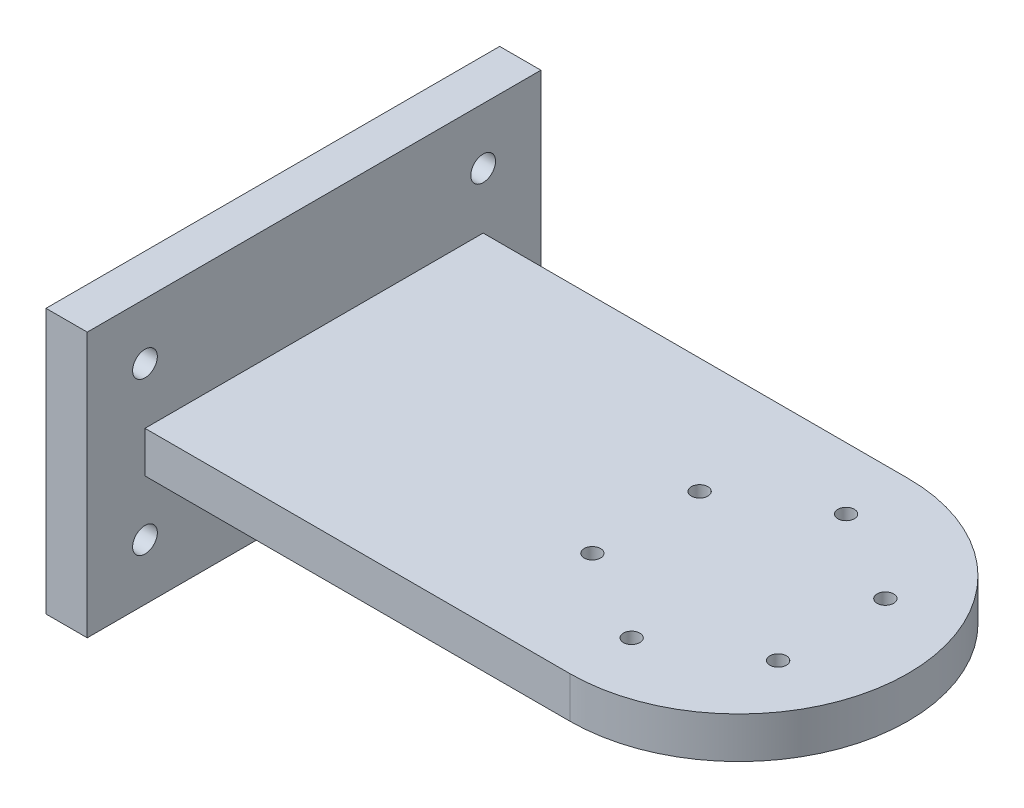
ISO-10303-21;
HEADER;
FILE_DESCRIPTION(('STEP AP214'),'2;1');
FILE_NAME('part.step','',(''),(''),'','','');
FILE_SCHEMA(('AUTOMOTIVE_DESIGN { 1 0 10303 214 1 1 1 1 }'));
ENDSEC;
DATA;
#1=APPLICATION_CONTEXT('core data for automotive mechanical design processes');
#2=APPLICATION_PROTOCOL_DEFINITION('international standard','automotive_design',2000,#1);
#3=PRODUCT_CONTEXT('',#1,'mechanical');
#4=PRODUCT('Part','Part','',(#3));
#5=PRODUCT_RELATED_PRODUCT_CATEGORY('part','',(#4));
#6=PRODUCT_DEFINITION_FORMATION('','',#4);
#7=PRODUCT_DEFINITION_CONTEXT('part definition',#1,'design');
#8=PRODUCT_DEFINITION('design','',#6,#7);
#9=PRODUCT_DEFINITION_SHAPE('','',#8);
#10=(LENGTH_UNIT() NAMED_UNIT(*) SI_UNIT(.MILLI.,.METRE.));
#11=(NAMED_UNIT(*) PLANE_ANGLE_UNIT() SI_UNIT($,.RADIAN.));
#12=(NAMED_UNIT(*) SI_UNIT($,.STERADIAN.) SOLID_ANGLE_UNIT());
#13=UNCERTAINTY_MEASURE_WITH_UNIT(LENGTH_MEASURE(1.E-05),#10,'distance_accuracy_value','');
#14=(GEOMETRIC_REPRESENTATION_CONTEXT(3) GLOBAL_UNCERTAINTY_ASSIGNED_CONTEXT((#13)) GLOBAL_UNIT_ASSIGNED_CONTEXT((#10,
#11,#12)) REPRESENTATION_CONTEXT('',''));
#15=CARTESIAN_POINT('',(0.,0.,0.));
#16=DIRECTION('',(0.,0.,1.));
#17=DIRECTION('',(1.,0.,0.));
#18=AXIS2_PLACEMENT_3D('',#15,#16,#17);
#19=CARTESIAN_POINT('',(0.,-10.,0.));
#20=DIRECTION('',(0.,1.,0.));
#21=DIRECTION('',(1.,0.,0.));
#22=AXIS2_PLACEMENT_3D('',#19,#20,#21);
#23=PLANE('',#22);
#24=CARTESIAN_POINT('',(-22.5166604983954,-10.,13.));
#25=DIRECTION('',(0.,1.,0.));
#26=DIRECTION('',(-1.,0.,0.));
#27=AXIS2_PLACEMENT_3D('',#24,#25,#26);
#28=CIRCLE('',#27,2.);
#29=CARTESIAN_POINT('',(-20.5166604983954,-10.,13.));
#30=VERTEX_POINT('',#29);
#31=EDGE_CURVE('E39',#30,#30,#28,.T.);
#32=ORIENTED_EDGE('',*,*,#31,.T.);
#33=EDGE_LOOP('',(#32));
#34=FACE_BOUND('',#33,.T.);
#35=CARTESIAN_POINT('',(22.5166604983954,-10.,13.));
#36=DIRECTION('',(0.,1.,0.));
#37=DIRECTION('',(-1.,0.,0.));
#38=AXIS2_PLACEMENT_3D('',#35,#36,#37);
#39=CIRCLE('',#38,2.);
#40=CARTESIAN_POINT('',(24.5166604983954,-10.,13.));
#41=VERTEX_POINT('',#40);
#42=EDGE_CURVE('E142',#41,#41,#39,.T.);
#43=ORIENTED_EDGE('',*,*,#42,.T.);
#44=EDGE_LOOP('',(#43));
#45=FACE_BOUND('',#44,.T.);
#46=CARTESIAN_POINT('',(22.5166604983954,-10.,-13.));
#47=DIRECTION('',(0.,1.,0.));
#48=DIRECTION('',(-1.,0.,0.));
#49=AXIS2_PLACEMENT_3D('',#46,#47,#48);
#50=CIRCLE('',#49,2.);
#51=CARTESIAN_POINT('',(24.5166604983954,-10.,-13.));
#52=VERTEX_POINT('',#51);
#53=EDGE_CURVE('E312',#52,#52,#50,.T.);
#54=ORIENTED_EDGE('',*,*,#53,.T.);
#55=EDGE_LOOP('',(#54));
#56=FACE_BOUND('',#55,.T.);
#57=CARTESIAN_POINT('',(-22.5166604983954,-10.,-13.));
#58=DIRECTION('',(0.,1.,0.));
#59=DIRECTION('',(-1.,0.,0.));
#60=AXIS2_PLACEMENT_3D('',#57,#58,#59);
#61=CIRCLE('',#60,2.);
#62=CARTESIAN_POINT('',(-20.5166604983954,-10.,-13.));
#63=VERTEX_POINT('',#62);
#64=EDGE_CURVE('E293',#63,#63,#61,.T.);
#65=ORIENTED_EDGE('',*,*,#64,.T.);
#66=EDGE_LOOP('',(#65));
#67=FACE_BOUND('',#66,.T.);
#68=CARTESIAN_POINT('',(0.,-10.,26.));
#69=DIRECTION('',(0.,1.,0.));
#70=DIRECTION('',(-1.,0.,0.));
#71=AXIS2_PLACEMENT_3D('',#68,#69,#70);
#72=CIRCLE('',#71,2.);
#73=CARTESIAN_POINT('',(2.,-10.,26.));
#74=VERTEX_POINT('',#73);
#75=EDGE_CURVE('E238',#74,#74,#72,.T.);
#76=ORIENTED_EDGE('',*,*,#75,.T.);
#77=EDGE_LOOP('',(#76));
#78=FACE_BOUND('',#77,.T.);
#79=CARTESIAN_POINT('',(0.,-10.,-26.));
#80=DIRECTION('',(0.,1.,0.));
#81=DIRECTION('',(-1.,0.,0.));
#82=AXIS2_PLACEMENT_3D('',#79,#80,#81);
#83=CIRCLE('',#82,2.);
#84=CARTESIAN_POINT('',(2.,-10.,-26.));
#85=VERTEX_POINT('',#84);
#86=EDGE_CURVE('E255',#85,#85,#83,.T.);
#87=ORIENTED_EDGE('',*,*,#86,.T.);
#88=EDGE_LOOP('',(#87));
#89=FACE_BOUND('',#88,.T.);
#90=CARTESIAN_POINT('',(0.,-10.,0.));
#91=DIRECTION('',(0.,-1.,0.));
#92=DIRECTION('',(-1.,0.,0.));
#93=AXIS2_PLACEMENT_3D('',#90,#91,#92);
#94=CIRCLE('',#93,41.);
#95=CARTESIAN_POINT('',(0.,-10.,-41.));
#96=VERTEX_POINT('',#95);
#97=CARTESIAN_POINT('',(0.,-10.,41.));
#98=VERTEX_POINT('',#97);
#99=EDGE_CURVE('E11',#96,#98,#94,.T.);
#100=ORIENTED_EDGE('',*,*,#99,.T.);
#101=DIRECTION('',(-1.,0.,0.));
#102=VECTOR('',#101,1.);
#103=CARTESIAN_POINT('',(-103.,-10.,41.));
#104=LINE('',#103,#102);
#105=CARTESIAN_POINT('',(-103.,-10.,41.));
#106=VERTEX_POINT('',#105);
#107=EDGE_CURVE('E265',#98,#106,#104,.T.);
#108=ORIENTED_EDGE('',*,*,#107,.T.);
#109=DIRECTION('',(0.,0.,-1.));
#110=VECTOR('',#109,1.);
#111=CARTESIAN_POINT('',(-103.,-10.,-41.));
#112=LINE('',#111,#110);
#113=CARTESIAN_POINT('',(-103.,-10.,-41.));
#114=VERTEX_POINT('',#113);
#115=EDGE_CURVE('E204',#106,#114,#112,.T.);
#116=ORIENTED_EDGE('',*,*,#115,.T.);
#117=DIRECTION('',(1.,0.,0.));
#118=VECTOR('',#117,1.);
#119=CARTESIAN_POINT('',(0.,-10.,-41.));
#120=LINE('',#119,#118);
#121=EDGE_CURVE('E199',#114,#96,#120,.T.);
#122=ORIENTED_EDGE('',*,*,#121,.T.);
#123=EDGE_LOOP('',(#100,#108,#116,#122));
#124=FACE_BOUND('',#123,.T.);
#125=ADVANCED_FACE('F17',(#34,#45,#56,#67,#78,#89,#124),#23,.F.);
#126=CARTESIAN_POINT('',(0.,0.,0.));
#127=DIRECTION('',(0.,1.,0.));
#128=DIRECTION('',(1.,0.,0.));
#129=AXIS2_PLACEMENT_3D('',#126,#127,#128);
#130=PLANE('',#129);
#131=CARTESIAN_POINT('',(-22.5166604983954,0.,13.));
#132=DIRECTION('',(0.,-1.,0.));
#133=DIRECTION('',(-1.,0.,0.));
#134=AXIS2_PLACEMENT_3D('',#131,#132,#133);
#135=CIRCLE('',#134,2.);
#136=CARTESIAN_POINT('',(-20.5166604983954,0.,13.));
#137=VERTEX_POINT('',#136);
#138=EDGE_CURVE('E343',#137,#137,#135,.T.);
#139=ORIENTED_EDGE('',*,*,#138,.T.);
#140=EDGE_LOOP('',(#139));
#141=FACE_BOUND('',#140,.T.);
#142=CARTESIAN_POINT('',(22.5166604983954,0.,13.));
#143=DIRECTION('',(0.,-1.,0.));
#144=DIRECTION('',(-1.,0.,0.));
#145=AXIS2_PLACEMENT_3D('',#142,#143,#144);
#146=CIRCLE('',#145,2.);
#147=CARTESIAN_POINT('',(24.5166604983954,0.,13.));
#148=VERTEX_POINT('',#147);
#149=EDGE_CURVE('E257',#148,#148,#146,.T.);
#150=ORIENTED_EDGE('',*,*,#149,.T.);
#151=EDGE_LOOP('',(#150));
#152=FACE_BOUND('',#151,.T.);
#153=CARTESIAN_POINT('',(22.5166604983954,0.,-13.));
#154=DIRECTION('',(0.,-1.,0.));
#155=DIRECTION('',(-1.,0.,0.));
#156=AXIS2_PLACEMENT_3D('',#153,#154,#155);
#157=CIRCLE('',#156,2.);
#158=CARTESIAN_POINT('',(24.5166604983954,0.,-13.));
#159=VERTEX_POINT('',#158);
#160=EDGE_CURVE('E313',#159,#159,#157,.T.);
#161=ORIENTED_EDGE('',*,*,#160,.T.);
#162=EDGE_LOOP('',(#161));
#163=FACE_BOUND('',#162,.T.);
#164=CARTESIAN_POINT('',(-22.5166604983954,0.,-13.));
#165=DIRECTION('',(0.,-1.,0.));
#166=DIRECTION('',(-1.,0.,0.));
#167=AXIS2_PLACEMENT_3D('',#164,#165,#166);
#168=CIRCLE('',#167,2.);
#169=CARTESIAN_POINT('',(-20.5166604983954,0.,-13.));
#170=VERTEX_POINT('',#169);
#171=EDGE_CURVE('E233',#170,#170,#168,.T.);
#172=ORIENTED_EDGE('',*,*,#171,.T.);
#173=EDGE_LOOP('',(#172));
#174=FACE_BOUND('',#173,.T.);
#175=CARTESIAN_POINT('',(0.,0.,26.));
#176=DIRECTION('',(0.,-1.,0.));
#177=DIRECTION('',(-1.,0.,0.));
#178=AXIS2_PLACEMENT_3D('',#175,#176,#177);
#179=CIRCLE('',#178,2.);
#180=CARTESIAN_POINT('',(2.,0.,26.));
#181=VERTEX_POINT('',#180);
#182=EDGE_CURVE('E270',#181,#181,#179,.T.);
#183=ORIENTED_EDGE('',*,*,#182,.T.);
#184=EDGE_LOOP('',(#183));
#185=FACE_BOUND('',#184,.T.);
#186=CARTESIAN_POINT('',(0.,0.,-26.));
#187=DIRECTION('',(0.,-1.,0.));
#188=DIRECTION('',(-1.,0.,0.));
#189=AXIS2_PLACEMENT_3D('',#186,#187,#188);
#190=CIRCLE('',#189,2.);
#191=CARTESIAN_POINT('',(2.,0.,-26.));
#192=VERTEX_POINT('',#191);
#193=EDGE_CURVE('E239',#192,#192,#190,.T.);
#194=ORIENTED_EDGE('',*,*,#193,.T.);
#195=EDGE_LOOP('',(#194));
#196=FACE_BOUND('',#195,.T.);
#197=CARTESIAN_POINT('',(0.,0.,0.));
#198=DIRECTION('',(0.,1.,0.));
#199=DIRECTION('',(-1.,0.,0.));
#200=AXIS2_PLACEMENT_3D('',#197,#198,#199);
#201=CIRCLE('',#200,41.);
#202=CARTESIAN_POINT('',(0.,0.,41.));
#203=VERTEX_POINT('',#202);
#204=CARTESIAN_POINT('',(0.,0.,-41.));
#205=VERTEX_POINT('',#204);
#206=EDGE_CURVE('E28',#203,#205,#201,.T.);
#207=ORIENTED_EDGE('',*,*,#206,.T.);
#208=DIRECTION('',(-1.,0.,0.));
#209=VECTOR('',#208,1.);
#210=CARTESIAN_POINT('',(0.,0.,-41.));
#211=LINE('',#210,#209);
#212=CARTESIAN_POINT('',(-103.,0.,-41.));
#213=VERTEX_POINT('',#212);
#214=EDGE_CURVE('E181',#205,#213,#211,.T.);
#215=ORIENTED_EDGE('',*,*,#214,.T.);
#216=DIRECTION('',(0.,0.,1.));
#217=VECTOR('',#216,1.);
#218=CARTESIAN_POINT('',(-103.,0.,-41.));
#219=LINE('',#218,#217);
#220=CARTESIAN_POINT('',(-103.,0.,41.));
#221=VERTEX_POINT('',#220);
#222=EDGE_CURVE('E186',#213,#221,#219,.T.);
#223=ORIENTED_EDGE('',*,*,#222,.T.);
#224=DIRECTION('',(1.,0.,0.));
#225=VECTOR('',#224,1.);
#226=CARTESIAN_POINT('',(-103.,0.,41.));
#227=LINE('',#226,#225);
#228=EDGE_CURVE('E262',#221,#203,#227,.T.);
#229=ORIENTED_EDGE('',*,*,#228,.T.);
#230=EDGE_LOOP('',(#207,#215,#223,#229));
#231=FACE_BOUND('',#230,.T.);
#232=ADVANCED_FACE('F183',(#141,#152,#163,#174,#185,#196,#231),#130,.T.);
#233=CARTESIAN_POINT('',(0.,0.,0.));
#234=DIRECTION('',(0.,-1.,0.));
#235=DIRECTION('',(1.,0.,0.));
#236=AXIS2_PLACEMENT_3D('',#233,#234,#235);
#237=CYLINDRICAL_SURFACE('',#236,41.);
#238=DIRECTION('',(0.,-1.,0.));
#239=VECTOR('',#238,1.);
#240=CARTESIAN_POINT('',(0.,0.,-41.));
#241=LINE('',#240,#239);
#242=EDGE_CURVE('E192',#205,#96,#241,.T.);
#243=ORIENTED_EDGE('',*,*,#242,.F.);
#244=ORIENTED_EDGE('',*,*,#206,.F.);
#245=DIRECTION('',(0.,-1.,0.));
#246=VECTOR('',#245,1.);
#247=CARTESIAN_POINT('',(0.,0.,41.));
#248=LINE('',#247,#246);
#249=EDGE_CURVE('E21',#203,#98,#248,.T.);
#250=ORIENTED_EDGE('',*,*,#249,.T.);
#251=ORIENTED_EDGE('',*,*,#99,.F.);
#252=EDGE_LOOP('',(#243,#244,#250,#251));
#253=FACE_BOUND('',#252,.T.);
#254=ADVANCED_FACE('F443',(#253),#237,.T.);
#255=CARTESIAN_POINT('',(-22.5166604983954,0.,13.));
#256=DIRECTION('',(0.,-1.,0.));
#257=DIRECTION('',(-1.,0.,0.));
#258=AXIS2_PLACEMENT_3D('',#255,#256,#257);
#259=CYLINDRICAL_SURFACE('',#258,2.);
#260=ORIENTED_EDGE('',*,*,#138,.F.);
#261=DIRECTION('',(0.,-1.,0.));
#262=VECTOR('',#261,1.);
#263=CARTESIAN_POINT('',(-20.5166604983954,0.,13.));
#264=LINE('',#263,#262);
#265=EDGE_CURVE('E335',#137,#30,#264,.T.);
#266=ORIENTED_EDGE('',*,*,#265,.T.);
#267=ORIENTED_EDGE('',*,*,#31,.F.);
#268=ORIENTED_EDGE('',*,*,#265,.F.);
#269=EDGE_LOOP('',(#260,#266,#267,#268));
#270=FACE_BOUND('',#269,.T.);
#271=ADVANCED_FACE('F454',(#270),#259,.F.);
#272=CARTESIAN_POINT('',(22.5166604983954,0.,13.));
#273=DIRECTION('',(0.,-1.,0.));
#274=DIRECTION('',(-1.,0.,0.));
#275=AXIS2_PLACEMENT_3D('',#272,#273,#274);
#276=CYLINDRICAL_SURFACE('',#275,2.);
#277=ORIENTED_EDGE('',*,*,#149,.F.);
#278=DIRECTION('',(0.,-1.,0.));
#279=VECTOR('',#278,1.);
#280=CARTESIAN_POINT('',(24.5166604983954,0.,13.));
#281=LINE('',#280,#279);
#282=EDGE_CURVE('E152',#148,#41,#281,.T.);
#283=ORIENTED_EDGE('',*,*,#282,.T.);
#284=ORIENTED_EDGE('',*,*,#42,.F.);
#285=ORIENTED_EDGE('',*,*,#282,.F.);
#286=EDGE_LOOP('',(#277,#283,#284,#285));
#287=FACE_BOUND('',#286,.T.);
#288=ADVANCED_FACE('F450',(#287),#276,.F.);
#289=CARTESIAN_POINT('',(22.5166604983954,0.,-13.));
#290=DIRECTION('',(0.,-1.,0.));
#291=DIRECTION('',(-1.,0.,0.));
#292=AXIS2_PLACEMENT_3D('',#289,#290,#291);
#293=CYLINDRICAL_SURFACE('',#292,2.);
#294=ORIENTED_EDGE('',*,*,#160,.F.);
#295=DIRECTION('',(0.,-1.,0.));
#296=VECTOR('',#295,1.);
#297=CARTESIAN_POINT('',(24.5166604983954,0.,-13.));
#298=LINE('',#297,#296);
#299=EDGE_CURVE('E308',#159,#52,#298,.T.);
#300=ORIENTED_EDGE('',*,*,#299,.T.);
#301=ORIENTED_EDGE('',*,*,#53,.F.);
#302=ORIENTED_EDGE('',*,*,#299,.F.);
#303=EDGE_LOOP('',(#294,#300,#301,#302));
#304=FACE_BOUND('',#303,.T.);
#305=ADVANCED_FACE('F453',(#304),#293,.F.);
#306=CARTESIAN_POINT('',(-22.5166604983954,0.,-13.));
#307=DIRECTION('',(0.,-1.,0.));
#308=DIRECTION('',(-1.,0.,0.));
#309=AXIS2_PLACEMENT_3D('',#306,#307,#308);
#310=CYLINDRICAL_SURFACE('',#309,2.);
#311=ORIENTED_EDGE('',*,*,#171,.F.);
#312=DIRECTION('',(0.,-1.,0.));
#313=VECTOR('',#312,1.);
#314=CARTESIAN_POINT('',(-20.5166604983954,0.,-13.));
#315=LINE('',#314,#313);
#316=EDGE_CURVE('E237',#170,#63,#315,.T.);
#317=ORIENTED_EDGE('',*,*,#316,.T.);
#318=ORIENTED_EDGE('',*,*,#64,.F.);
#319=ORIENTED_EDGE('',*,*,#316,.F.);
#320=EDGE_LOOP('',(#311,#317,#318,#319));
#321=FACE_BOUND('',#320,.T.);
#322=ADVANCED_FACE('F456',(#321),#310,.F.);
#323=CARTESIAN_POINT('',(0.,0.,26.));
#324=DIRECTION('',(0.,-1.,0.));
#325=DIRECTION('',(-1.,0.,0.));
#326=AXIS2_PLACEMENT_3D('',#323,#324,#325);
#327=CYLINDRICAL_SURFACE('',#326,2.);
#328=ORIENTED_EDGE('',*,*,#182,.F.);
#329=DIRECTION('',(0.,-1.,0.));
#330=VECTOR('',#329,1.);
#331=CARTESIAN_POINT('',(2.,0.,26.));
#332=LINE('',#331,#330);
#333=EDGE_CURVE('E266',#181,#74,#332,.T.);
#334=ORIENTED_EDGE('',*,*,#333,.T.);
#335=ORIENTED_EDGE('',*,*,#75,.F.);
#336=ORIENTED_EDGE('',*,*,#333,.F.);
#337=EDGE_LOOP('',(#328,#334,#335,#336));
#338=FACE_BOUND('',#337,.T.);
#339=ADVANCED_FACE('F479',(#338),#327,.F.);
#340=CARTESIAN_POINT('',(0.,0.,-26.));
#341=DIRECTION('',(0.,-1.,0.));
#342=DIRECTION('',(-1.,0.,0.));
#343=AXIS2_PLACEMENT_3D('',#340,#341,#342);
#344=CYLINDRICAL_SURFACE('',#343,2.);
#345=ORIENTED_EDGE('',*,*,#193,.F.);
#346=DIRECTION('',(0.,-1.,0.));
#347=VECTOR('',#346,1.);
#348=CARTESIAN_POINT('',(2.,0.,-26.));
#349=LINE('',#348,#347);
#350=EDGE_CURVE('E242',#192,#85,#349,.T.);
#351=ORIENTED_EDGE('',*,*,#350,.T.);
#352=ORIENTED_EDGE('',*,*,#86,.F.);
#353=ORIENTED_EDGE('',*,*,#350,.F.);
#354=EDGE_LOOP('',(#345,#351,#352,#353));
#355=FACE_BOUND('',#354,.T.);
#356=ADVANCED_FACE('F477',(#355),#344,.F.);
#357=CARTESIAN_POINT('',(0.,0.,41.));
#358=DIRECTION('',(0.,0.,1.));
#359=DIRECTION('',(1.,0.,0.));
#360=AXIS2_PLACEMENT_3D('',#357,#358,#359);
#361=PLANE('',#360);
#362=ORIENTED_EDGE('',*,*,#228,.F.);
#363=DIRECTION('',(0.,-1.,0.));
#364=VECTOR('',#363,1.);
#365=CARTESIAN_POINT('',(-103.,0.,41.));
#366=LINE('',#365,#364);
#367=EDGE_CURVE('E209',#221,#106,#366,.T.);
#368=ORIENTED_EDGE('',*,*,#367,.T.);
#369=ORIENTED_EDGE('',*,*,#107,.F.);
#370=ORIENTED_EDGE('',*,*,#249,.F.);
#371=EDGE_LOOP('',(#362,#368,#369,#370));
#372=FACE_BOUND('',#371,.T.);
#373=ADVANCED_FACE('F471',(#372),#361,.T.);
#374=CARTESIAN_POINT('',(-103.,0.,-41.));
#375=DIRECTION('',(0.,0.,-1.));
#376=DIRECTION('',(0.,-1.,0.));
#377=AXIS2_PLACEMENT_3D('',#374,#375,#376);
#378=PLANE('',#377);
#379=ORIENTED_EDGE('',*,*,#214,.F.);
#380=ORIENTED_EDGE('',*,*,#242,.T.);
#381=ORIENTED_EDGE('',*,*,#121,.F.);
#382=DIRECTION('',(0.,-1.,0.));
#383=VECTOR('',#382,1.);
#384=CARTESIAN_POINT('',(-103.,0.,-41.));
#385=LINE('',#384,#383);
#386=EDGE_CURVE('E196',#213,#114,#385,.T.);
#387=ORIENTED_EDGE('',*,*,#386,.F.);
#388=EDGE_LOOP('',(#379,#380,#381,#387));
#389=FACE_BOUND('',#388,.T.);
#390=ADVANCED_FACE('F197',(#389),#378,.T.);
#391=CARTESIAN_POINT('',(-113.,-4.9,0.));
#392=DIRECTION('',(-1.,0.,0.));
#393=DIRECTION('',(0.,0.,1.));
#394=AXIS2_PLACEMENT_3D('',#391,#392,#393);
#395=PLANE('',#394);
#396=CARTESIAN_POINT('',(-113.,-23.4,41.));
#397=DIRECTION('',(1.,0.,0.));
#398=DIRECTION('',(0.,0.,-1.));
#399=AXIS2_PLACEMENT_3D('',#396,#397,#398);
#400=CIRCLE('',#399,3.);
#401=CARTESIAN_POINT('',(-113.,-23.4,44.));
#402=VERTEX_POINT('',#401);
#403=EDGE_CURVE('E304',#402,#402,#400,.T.);
#404=ORIENTED_EDGE('',*,*,#403,.T.);
#405=EDGE_LOOP('',(#404));
#406=FACE_BOUND('',#405,.T.);
#407=CARTESIAN_POINT('',(-113.,-23.4,-41.));
#408=DIRECTION('',(1.,0.,0.));
#409=DIRECTION('',(0.,0.,-1.));
#410=AXIS2_PLACEMENT_3D('',#407,#408,#409);
#411=CIRCLE('',#410,3.);
#412=CARTESIAN_POINT('',(-113.,-23.4,-38.));
#413=VERTEX_POINT('',#412);
#414=EDGE_CURVE('E261',#413,#413,#411,.T.);
#415=ORIENTED_EDGE('',*,*,#414,.T.);
#416=EDGE_LOOP('',(#415));
#417=FACE_BOUND('',#416,.T.);
#418=CARTESIAN_POINT('',(-113.,13.6,41.));
#419=DIRECTION('',(1.,0.,0.));
#420=DIRECTION('',(0.,0.,-1.));
#421=AXIS2_PLACEMENT_3D('',#418,#419,#420);
#422=CIRCLE('',#421,3.);
#423=CARTESIAN_POINT('',(-113.,13.6,44.));
#424=VERTEX_POINT('',#423);
#425=EDGE_CURVE('E222',#424,#424,#422,.T.);
#426=ORIENTED_EDGE('',*,*,#425,.T.);
#427=EDGE_LOOP('',(#426));
#428=FACE_BOUND('',#427,.T.);
#429=CARTESIAN_POINT('',(-113.,13.6,-41.));
#430=DIRECTION('',(1.,0.,0.));
#431=DIRECTION('',(0.,0.,-1.));
#432=AXIS2_PLACEMENT_3D('',#429,#430,#431);
#433=CIRCLE('',#432,3.);
#434=CARTESIAN_POINT('',(-113.,13.6,-38.));
#435=VERTEX_POINT('',#434);
#436=EDGE_CURVE('E273',#435,#435,#433,.T.);
#437=ORIENTED_EDGE('',*,*,#436,.T.);
#438=EDGE_LOOP('',(#437));
#439=FACE_BOUND('',#438,.T.);
#440=DIRECTION('',(0.,0.,1.));
#441=VECTOR('',#440,1.);
#442=CARTESIAN_POINT('',(-113.,-37.,-55.));
#443=LINE('',#442,#441);
#444=CARTESIAN_POINT('',(-113.,-37.,-55.));
#445=VERTEX_POINT('',#444);
#446=CARTESIAN_POINT('',(-113.,-37.,55.));
#447=VERTEX_POINT('',#446);
#448=EDGE_CURVE('E193',#445,#447,#443,.T.);
#449=ORIENTED_EDGE('',*,*,#448,.T.);
#450=DIRECTION('',(0.,1.,0.));
#451=VECTOR('',#450,1.);
#452=CARTESIAN_POINT('',(-113.,-37.,55.));
#453=LINE('',#452,#451);
#454=CARTESIAN_POINT('',(-113.,27.2,55.));
#455=VERTEX_POINT('',#454);
#456=EDGE_CURVE('E232',#447,#455,#453,.T.);
#457=ORIENTED_EDGE('',*,*,#456,.T.);
#458=DIRECTION('',(0.,0.,-1.));
#459=VECTOR('',#458,1.);
#460=CARTESIAN_POINT('',(-113.,27.2,55.));
#461=LINE('',#460,#459);
#462=CARTESIAN_POINT('',(-113.,27.2,-55.));
#463=VERTEX_POINT('',#462);
#464=EDGE_CURVE('E274',#455,#463,#461,.T.);
#465=ORIENTED_EDGE('',*,*,#464,.T.);
#466=DIRECTION('',(0.,-1.,0.));
#467=VECTOR('',#466,1.);
#468=CARTESIAN_POINT('',(-113.,27.2,-55.));
#469=LINE('',#468,#467);
#470=EDGE_CURVE('E317',#463,#445,#469,.T.);
#471=ORIENTED_EDGE('',*,*,#470,.T.);
#472=EDGE_LOOP('',(#449,#457,#465,#471));
#473=FACE_BOUND('',#472,.T.);
#474=ADVANCED_FACE('F414',(#406,#417,#428,#439,#473),#395,.T.);
#475=CARTESIAN_POINT('',(-103.,-37.,-55.));
#476=DIRECTION('',(0.,-1.,0.));
#477=DIRECTION('',(0.,0.,-1.));
#478=AXIS2_PLACEMENT_3D('',#475,#476,#477);
#479=PLANE('',#478);
#480=DIRECTION('',(0.,0.,1.));
#481=VECTOR('',#480,1.);
#482=CARTESIAN_POINT('',(-103.,-37.,-55.));
#483=LINE('',#482,#481);
#484=CARTESIAN_POINT('',(-103.,-37.,-55.));
#485=VERTEX_POINT('',#484);
#486=CARTESIAN_POINT('',(-103.,-37.,55.));
#487=VERTEX_POINT('',#486);
#488=EDGE_CURVE('E251',#485,#487,#483,.T.);
#489=ORIENTED_EDGE('',*,*,#488,.T.);
#490=DIRECTION('',(-1.,0.,0.));
#491=VECTOR('',#490,1.);
#492=CARTESIAN_POINT('',(-103.,-37.,55.));
#493=LINE('',#492,#491);
#494=EDGE_CURVE('E228',#487,#447,#493,.T.);
#495=ORIENTED_EDGE('',*,*,#494,.T.);
#496=ORIENTED_EDGE('',*,*,#448,.F.);
#497=DIRECTION('',(-1.,0.,0.));
#498=VECTOR('',#497,1.);
#499=CARTESIAN_POINT('',(-103.,-37.,-55.));
#500=LINE('',#499,#498);
#501=EDGE_CURVE('E297',#485,#445,#500,.T.);
#502=ORIENTED_EDGE('',*,*,#501,.F.);
#503=EDGE_LOOP('',(#489,#495,#496,#502));
#504=FACE_BOUND('',#503,.T.);
#505=ADVANCED_FACE('F403',(#504),#479,.T.);
#506=CARTESIAN_POINT('',(-103.,-37.,55.));
#507=DIRECTION('',(0.,0.,1.));
#508=DIRECTION('',(1.,0.,0.));
#509=AXIS2_PLACEMENT_3D('',#506,#507,#508);
#510=PLANE('',#509);
#511=DIRECTION('',(0.,1.,0.));
#512=VECTOR('',#511,1.);
#513=CARTESIAN_POINT('',(-103.,-37.,55.));
#514=LINE('',#513,#512);
#515=CARTESIAN_POINT('',(-103.,27.2,55.));
#516=VERTEX_POINT('',#515);
#517=EDGE_CURVE('E279',#487,#516,#514,.T.);
#518=ORIENTED_EDGE('',*,*,#517,.T.);
#519=DIRECTION('',(-1.,0.,0.));
#520=VECTOR('',#519,1.);
#521=CARTESIAN_POINT('',(-103.,27.2,55.));
#522=LINE('',#521,#520);
#523=EDGE_CURVE('E277',#516,#455,#522,.T.);
#524=ORIENTED_EDGE('',*,*,#523,.T.);
#525=ORIENTED_EDGE('',*,*,#456,.F.);
#526=ORIENTED_EDGE('',*,*,#494,.F.);
#527=EDGE_LOOP('',(#518,#524,#525,#526));
#528=FACE_BOUND('',#527,.T.);
#529=ADVANCED_FACE('F416',(#528),#510,.T.);
#530=CARTESIAN_POINT('',(-103.,27.2,55.));
#531=DIRECTION('',(0.,1.,0.));
#532=DIRECTION('',(1.,0.,0.));
#533=AXIS2_PLACEMENT_3D('',#530,#531,#532);
#534=PLANE('',#533);
#535=DIRECTION('',(0.,0.,-1.));
#536=VECTOR('',#535,1.);
#537=CARTESIAN_POINT('',(-103.,27.2,55.));
#538=LINE('',#537,#536);
#539=CARTESIAN_POINT('',(-103.,27.2,-55.));
#540=VERTEX_POINT('',#539);
#541=EDGE_CURVE('E250',#516,#540,#538,.T.);
#542=ORIENTED_EDGE('',*,*,#541,.T.);
#543=DIRECTION('',(-1.,0.,0.));
#544=VECTOR('',#543,1.);
#545=CARTESIAN_POINT('',(-103.,27.2,-55.));
#546=LINE('',#545,#544);
#547=EDGE_CURVE('E278',#540,#463,#546,.T.);
#548=ORIENTED_EDGE('',*,*,#547,.T.);
#549=ORIENTED_EDGE('',*,*,#464,.F.);
#550=ORIENTED_EDGE('',*,*,#523,.F.);
#551=EDGE_LOOP('',(#542,#548,#549,#550));
#552=FACE_BOUND('',#551,.T.);
#553=ADVANCED_FACE('F419',(#552),#534,.T.);
#554=CARTESIAN_POINT('',(-103.,27.2,-55.));
#555=DIRECTION('',(0.,0.,-1.));
#556=DIRECTION('',(0.,-1.,0.));
#557=AXIS2_PLACEMENT_3D('',#554,#555,#556);
#558=PLANE('',#557);
#559=DIRECTION('',(0.,-1.,0.));
#560=VECTOR('',#559,1.);
#561=CARTESIAN_POINT('',(-103.,27.2,-55.));
#562=LINE('',#561,#560);
#563=EDGE_CURVE('E246',#540,#485,#562,.T.);
#564=ORIENTED_EDGE('',*,*,#563,.T.);
#565=ORIENTED_EDGE('',*,*,#501,.T.);
#566=ORIENTED_EDGE('',*,*,#470,.F.);
#567=ORIENTED_EDGE('',*,*,#547,.F.);
#568=EDGE_LOOP('',(#564,#565,#566,#567));
#569=FACE_BOUND('',#568,.T.);
#570=ADVANCED_FACE('F422',(#569),#558,.T.);
#571=CARTESIAN_POINT('',(-103.,13.6,-41.));
#572=DIRECTION('',(-1.,0.,0.));
#573=DIRECTION('',(0.,0.,-1.));
#574=AXIS2_PLACEMENT_3D('',#571,#572,#573);
#575=CYLINDRICAL_SURFACE('',#574,3.);
#576=ORIENTED_EDGE('',*,*,#436,.F.);
#577=DIRECTION('',(1.,0.,0.));
#578=VECTOR('',#577,1.);
#579=CARTESIAN_POINT('',(-103.,13.6,-38.));
#580=LINE('',#579,#578);
#581=CARTESIAN_POINT('',(-103.,13.6,-38.));
#582=VERTEX_POINT('',#581);
#583=EDGE_CURVE('E294',#435,#582,#580,.T.);
#584=ORIENTED_EDGE('',*,*,#583,.T.);
#585=CARTESIAN_POINT('',(-103.,13.6,-41.));
#586=DIRECTION('',(1.,0.,0.));
#587=DIRECTION('',(0.,0.,-1.));
#588=AXIS2_PLACEMENT_3D('',#585,#586,#587);
#589=CIRCLE('',#588,3.);
#590=EDGE_CURVE('E216',#582,#582,#589,.T.);
#591=ORIENTED_EDGE('',*,*,#590,.T.);
#592=ORIENTED_EDGE('',*,*,#583,.F.);
#593=EDGE_LOOP('',(#576,#584,#591,#592));
#594=FACE_BOUND('',#593,.T.);
#595=ADVANCED_FACE('F424',(#594),#575,.F.);
#596=CARTESIAN_POINT('',(-103.,13.6,41.));
#597=DIRECTION('',(-1.,0.,0.));
#598=DIRECTION('',(0.,0.,-1.));
#599=AXIS2_PLACEMENT_3D('',#596,#597,#598);
#600=CYLINDRICAL_SURFACE('',#599,3.);
#601=ORIENTED_EDGE('',*,*,#425,.F.);
#602=DIRECTION('',(1.,0.,0.));
#603=VECTOR('',#602,1.);
#604=CARTESIAN_POINT('',(-103.,13.6,44.));
#605=LINE('',#604,#603);
#606=CARTESIAN_POINT('',(-103.,13.6,44.));
#607=VERTEX_POINT('',#606);
#608=EDGE_CURVE('E226',#424,#607,#605,.T.);
#609=ORIENTED_EDGE('',*,*,#608,.T.);
#610=CARTESIAN_POINT('',(-103.,13.6,41.));
#611=DIRECTION('',(1.,0.,0.));
#612=DIRECTION('',(0.,0.,-1.));
#613=AXIS2_PLACEMENT_3D('',#610,#611,#612);
#614=CIRCLE('',#613,3.);
#615=EDGE_CURVE('E352',#607,#607,#614,.T.);
#616=ORIENTED_EDGE('',*,*,#615,.T.);
#617=ORIENTED_EDGE('',*,*,#608,.F.);
#618=EDGE_LOOP('',(#601,#609,#616,#617));
#619=FACE_BOUND('',#618,.T.);
#620=ADVANCED_FACE('F389',(#619),#600,.F.);
#621=CARTESIAN_POINT('',(-103.,-23.4,-41.));
#622=DIRECTION('',(-1.,0.,0.));
#623=DIRECTION('',(0.,0.,-1.));
#624=AXIS2_PLACEMENT_3D('',#621,#622,#623);
#625=CYLINDRICAL_SURFACE('',#624,3.);
#626=ORIENTED_EDGE('',*,*,#414,.F.);
#627=DIRECTION('',(1.,0.,0.));
#628=VECTOR('',#627,1.);
#629=CARTESIAN_POINT('',(-103.,-23.4,-38.));
#630=LINE('',#629,#628);
#631=CARTESIAN_POINT('',(-103.,-23.4,-38.));
#632=VERTEX_POINT('',#631);
#633=EDGE_CURVE('E227',#413,#632,#630,.T.);
#634=ORIENTED_EDGE('',*,*,#633,.T.);
#635=CARTESIAN_POINT('',(-103.,-23.4,-41.));
#636=DIRECTION('',(1.,0.,0.));
#637=DIRECTION('',(0.,0.,-1.));
#638=AXIS2_PLACEMENT_3D('',#635,#636,#637);
#639=CIRCLE('',#638,3.);
#640=EDGE_CURVE('E321',#632,#632,#639,.T.);
#641=ORIENTED_EDGE('',*,*,#640,.T.);
#642=ORIENTED_EDGE('',*,*,#633,.F.);
#643=EDGE_LOOP('',(#626,#634,#641,#642));
#644=FACE_BOUND('',#643,.T.);
#645=ADVANCED_FACE('F448',(#644),#625,.F.);
#646=CARTESIAN_POINT('',(-103.,-23.4,41.));
#647=DIRECTION('',(-1.,0.,0.));
#648=DIRECTION('',(0.,0.,-1.));
#649=AXIS2_PLACEMENT_3D('',#646,#647,#648);
#650=CYLINDRICAL_SURFACE('',#649,3.);
#651=ORIENTED_EDGE('',*,*,#403,.F.);
#652=DIRECTION('',(1.,0.,0.));
#653=VECTOR('',#652,1.);
#654=CARTESIAN_POINT('',(-103.,-23.4,44.));
#655=LINE('',#654,#653);
#656=CARTESIAN_POINT('',(-103.,-23.4,44.));
#657=VERTEX_POINT('',#656);
#658=EDGE_CURVE('E220',#402,#657,#655,.T.);
#659=ORIENTED_EDGE('',*,*,#658,.T.);
#660=CARTESIAN_POINT('',(-103.,-23.4,41.));
#661=DIRECTION('',(1.,0.,0.));
#662=DIRECTION('',(0.,0.,-1.));
#663=AXIS2_PLACEMENT_3D('',#660,#661,#662);
#664=CIRCLE('',#663,3.);
#665=EDGE_CURVE('E283',#657,#657,#664,.T.);
#666=ORIENTED_EDGE('',*,*,#665,.T.);
#667=ORIENTED_EDGE('',*,*,#658,.F.);
#668=EDGE_LOOP('',(#651,#659,#666,#667));
#669=FACE_BOUND('',#668,.T.);
#670=ADVANCED_FACE('F19',(#669),#650,.F.);
#671=CARTESIAN_POINT('',(-103.,-4.9,0.));
#672=DIRECTION('',(-1.,0.,0.));
#673=DIRECTION('',(0.,0.,1.));
#674=AXIS2_PLACEMENT_3D('',#671,#672,#673);
#675=PLANE('',#674);
#676=ORIENTED_EDGE('',*,*,#367,.F.);
#677=ORIENTED_EDGE('',*,*,#222,.F.);
#678=ORIENTED_EDGE('',*,*,#386,.T.);
#679=ORIENTED_EDGE('',*,*,#115,.F.);
#680=EDGE_LOOP('',(#676,#677,#678,#679));
#681=FACE_BOUND('',#680,.T.);
#682=ORIENTED_EDGE('',*,*,#590,.F.);
#683=EDGE_LOOP('',(#682));
#684=FACE_BOUND('',#683,.T.);
#685=ORIENTED_EDGE('',*,*,#615,.F.);
#686=EDGE_LOOP('',(#685));
#687=FACE_BOUND('',#686,.T.);
#688=ORIENTED_EDGE('',*,*,#640,.F.);
#689=EDGE_LOOP('',(#688));
#690=FACE_BOUND('',#689,.T.);
#691=ORIENTED_EDGE('',*,*,#665,.F.);
#692=EDGE_LOOP('',(#691));
#693=FACE_BOUND('',#692,.T.);
#694=ORIENTED_EDGE('',*,*,#488,.F.);
#695=ORIENTED_EDGE('',*,*,#563,.F.);
#696=ORIENTED_EDGE('',*,*,#541,.F.);
#697=ORIENTED_EDGE('',*,*,#517,.F.);
#698=EDGE_LOOP('',(#694,#695,#696,#697));
#699=FACE_BOUND('',#698,.T.);
#700=ADVANCED_FACE('F206',(#681,#684,#687,#690,#693,#699),#675,.F.);
#701=CLOSED_SHELL('',(#125,#232,#254,#271,#288,#305,#322,#339,#356,#373,#390,#474,#505,#529,
#553,#570,#595,#620,#645,#670,#700));
#702=MANIFOLD_SOLID_BREP('B1',#701);
#703=ADVANCED_BREP_SHAPE_REPRESENTATION('',(#18,#702),#14);
#704=SHAPE_DEFINITION_REPRESENTATION(#9,#703);
ENDSEC;
END-ISO-10303-21;
